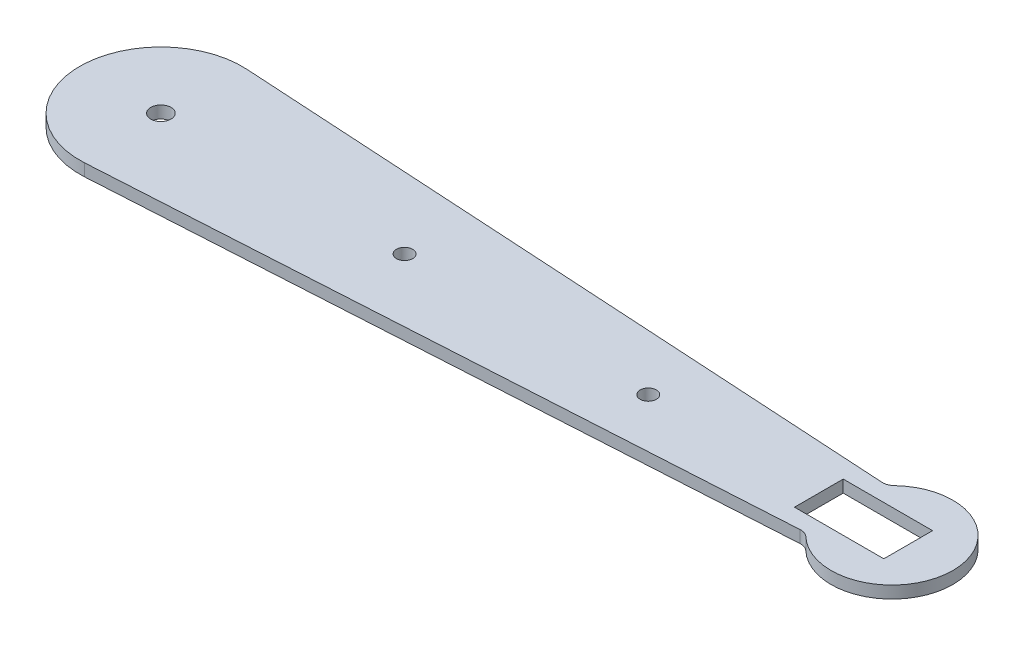
ISO-10303-21;
HEADER;
FILE_DESCRIPTION(('STEP AP214'),'2;1');
FILE_NAME('part.step','',(''),(''),'','','');
FILE_SCHEMA(('AUTOMOTIVE_DESIGN { 1 0 10303 214 1 1 1 1 }'));
ENDSEC;
DATA;
#1=APPLICATION_CONTEXT('core data for automotive mechanical design processes');
#2=APPLICATION_PROTOCOL_DEFINITION('international standard','automotive_design',2000,#1);
#3=PRODUCT_CONTEXT('',#1,'mechanical');
#4=PRODUCT('Part','Part','',(#3));
#5=PRODUCT_RELATED_PRODUCT_CATEGORY('part','',(#4));
#6=PRODUCT_DEFINITION_FORMATION('','',#4);
#7=PRODUCT_DEFINITION_CONTEXT('part definition',#1,'design');
#8=PRODUCT_DEFINITION('design','',#6,#7);
#9=PRODUCT_DEFINITION_SHAPE('','',#8);
#10=(LENGTH_UNIT() NAMED_UNIT(*) SI_UNIT(.MILLI.,.METRE.));
#11=(NAMED_UNIT(*) PLANE_ANGLE_UNIT() SI_UNIT($,.RADIAN.));
#12=(NAMED_UNIT(*) SI_UNIT($,.STERADIAN.) SOLID_ANGLE_UNIT());
#13=UNCERTAINTY_MEASURE_WITH_UNIT(LENGTH_MEASURE(1.E-05),#10,'distance_accuracy_value','');
#14=(GEOMETRIC_REPRESENTATION_CONTEXT(3) GLOBAL_UNCERTAINTY_ASSIGNED_CONTEXT((#13)) GLOBAL_UNIT_ASSIGNED_CONTEXT((#10,
#11,#12)) REPRESENTATION_CONTEXT('',''));
#15=CARTESIAN_POINT('',(0.,0.,0.));
#16=DIRECTION('',(0.,0.,1.));
#17=DIRECTION('',(1.,0.,0.));
#18=AXIS2_PLACEMENT_3D('',#15,#16,#17);
#19=CARTESIAN_POINT('',(167.629963347197,3.,13.076015953199));
#20=DIRECTION('',(0.,-1.,0.));
#21=DIRECTION('',(0.,0.,-1.));
#22=AXIS2_PLACEMENT_3D('',#19,#20,#21);
#23=CYLINDRICAL_SURFACE('',#22,3.);
#24=DIRECTION('',(0.,-1.,0.));
#25=VECTOR('',#24,1.);
#26=CARTESIAN_POINT('',(167.451945789046,3.,10.0813023193118));
#27=LINE('',#26,#25);
#28=CARTESIAN_POINT('',(167.451945789046,0.,10.0813023193118));
#29=VERTEX_POINT('',#28);
#30=CARTESIAN_POINT('',(167.451945789046,3.,10.0813023193118));
#31=VERTEX_POINT('',#30);
#32=EDGE_CURVE('E193',#29,#31,#27,.F.);
#33=ORIENTED_EDGE('',*,*,#32,.F.);
#34=CARTESIAN_POINT('',(167.629963347197,0.,13.076015953199));
#35=DIRECTION('',(0.,1.,0.));
#36=DIRECTION('',(0.,0.,1.));
#37=AXIS2_PLACEMENT_3D('',#34,#35,#36);
#38=CIRCLE('',#37,3.);
#39=CARTESIAN_POINT('',(169.691636122664,0.,10.8966799609992));
#40=VERTEX_POINT('',#39);
#41=EDGE_CURVE('E199',#29,#40,#38,.F.);
#42=ORIENTED_EDGE('',*,*,#41,.T.);
#43=DIRECTION('',(0.,-1.,0.));
#44=VECTOR('',#43,1.);
#45=CARTESIAN_POINT('',(169.691636122664,3.,10.8966799609992));
#46=LINE('',#45,#44);
#47=CARTESIAN_POINT('',(169.691636122664,3.,10.8966799609992));
#48=VERTEX_POINT('',#47);
#49=EDGE_CURVE('E196',#48,#40,#46,.T.);
#50=ORIENTED_EDGE('',*,*,#49,.F.);
#51=CARTESIAN_POINT('',(167.629963347197,3.,13.076015953199));
#52=DIRECTION('',(0.,1.,0.));
#53=DIRECTION('',(0.,0.,1.));
#54=AXIS2_PLACEMENT_3D('',#51,#52,#53);
#55=CIRCLE('',#54,3.);
#56=EDGE_CURVE('E201',#48,#31,#55,.T.);
#57=ORIENTED_EDGE('',*,*,#56,.T.);
#58=EDGE_LOOP('',(#33,#42,#50,#57));
#59=FACE_BOUND('',#58,.T.);
#60=ADVANCED_FACE('F36',(#59),#23,.F.);
#61=CARTESIAN_POINT('',(167.629963347197,3.,-13.076015953199));
#62=DIRECTION('',(0.,-1.,0.));
#63=DIRECTION('',(0.,0.,-1.));
#64=AXIS2_PLACEMENT_3D('',#61,#62,#63);
#65=CYLINDRICAL_SURFACE('',#64,3.);
#66=DIRECTION('',(0.,1.,0.));
#67=VECTOR('',#66,1.);
#68=CARTESIAN_POINT('',(167.451945789046,3.,-10.0813023193118));
#69=LINE('',#68,#67);
#70=CARTESIAN_POINT('',(167.451945789046,3.,-10.0813023193118));
#71=VERTEX_POINT('',#70);
#72=CARTESIAN_POINT('',(167.451945789046,0.,-10.0813023193118));
#73=VERTEX_POINT('',#72);
#74=EDGE_CURVE('E182',#71,#73,#69,.F.);
#75=ORIENTED_EDGE('',*,*,#74,.F.);
#76=CARTESIAN_POINT('',(167.629963347197,3.,-13.076015953199));
#77=DIRECTION('',(0.,1.,0.));
#78=DIRECTION('',(0.,0.,1.));
#79=AXIS2_PLACEMENT_3D('',#76,#77,#78);
#80=CIRCLE('',#79,3.);
#81=CARTESIAN_POINT('',(169.691636122664,3.,-10.8966799609992));
#82=VERTEX_POINT('',#81);
#83=EDGE_CURVE('E188',#71,#82,#80,.T.);
#84=ORIENTED_EDGE('',*,*,#83,.T.);
#85=DIRECTION('',(0.,-1.,0.));
#86=VECTOR('',#85,1.);
#87=CARTESIAN_POINT('',(169.691636122664,3.,-10.8966799609992));
#88=LINE('',#87,#86);
#89=CARTESIAN_POINT('',(169.691636122664,0.,-10.8966799609992));
#90=VERTEX_POINT('',#89);
#91=EDGE_CURVE('E185',#90,#82,#88,.F.);
#92=ORIENTED_EDGE('',*,*,#91,.F.);
#93=CARTESIAN_POINT('',(167.629963347197,0.,-13.076015953199));
#94=DIRECTION('',(0.,1.,0.));
#95=DIRECTION('',(0.,0.,1.));
#96=AXIS2_PLACEMENT_3D('',#93,#94,#95);
#97=CIRCLE('',#96,3.);
#98=EDGE_CURVE('E191',#90,#73,#97,.F.);
#99=ORIENTED_EDGE('',*,*,#98,.T.);
#100=EDGE_LOOP('',(#75,#84,#92,#99));
#101=FACE_BOUND('',#100,.T.);
#102=ADVANCED_FACE('F224',(#101),#65,.F.);
#103=CARTESIAN_POINT('',(-81.2636304353254,3.,24.8659344966924));
#104=DIRECTION('',(0.0593391860503703,0.,0.998237877962402));
#105=DIRECTION('',(0.998237877962402,0.,-0.0593391860503703));
#106=AXIS2_PLACEMENT_3D('',#103,#104,#105);
#107=PLANE('',#106);
#108=DIRECTION('',(-0.998237877962402,0.,0.0593391860503703));
#109=VECTOR('',#108,1.);
#110=CARTESIAN_POINT('',(-81.2636304353254,0.,24.8659344966924));
#111=LINE('',#110,#109);
#112=CARTESIAN_POINT('',(1.1867837210074,0.,19.964757559248));
#113=VERTEX_POINT('',#112);
#114=EDGE_CURVE('E163',#29,#113,#111,.T.);
#115=ORIENTED_EDGE('',*,*,#114,.F.);
#116=ORIENTED_EDGE('',*,*,#32,.T.);
#117=DIRECTION('',(-0.998237877962402,0.,0.0593391860503703));
#118=VECTOR('',#117,1.);
#119=CARTESIAN_POINT('',(-81.2636304353254,3.,24.8659344966924));
#120=LINE('',#119,#118);
#121=CARTESIAN_POINT('',(1.1867837210074,3.,19.964757559248));
#122=VERTEX_POINT('',#121);
#123=EDGE_CURVE('E144',#31,#122,#120,.T.);
#124=ORIENTED_EDGE('',*,*,#123,.T.);
#125=DIRECTION('',(0.,-1.,0.));
#126=VECTOR('',#125,1.);
#127=CARTESIAN_POINT('',(1.1867837210074,3.,19.964757559248));
#128=LINE('',#127,#126);
#129=EDGE_CURVE('E160',#122,#113,#128,.T.);
#130=ORIENTED_EDGE('',*,*,#129,.T.);
#131=EDGE_LOOP('',(#115,#116,#124,#130));
#132=FACE_BOUND('',#131,.T.);
#133=ADVANCED_FACE('F229',(#132),#107,.T.);
#134=CARTESIAN_POINT('',(180.,3.,0.));
#135=DIRECTION('',(0.,-1.,0.));
#136=DIRECTION('',(0.,0.,-1.));
#137=AXIS2_PLACEMENT_3D('',#134,#135,#136);
#138=CYLINDRICAL_SURFACE('',#137,15.);
#139=CARTESIAN_POINT('',(180.,3.,0.));
#140=DIRECTION('',(0.,1.,0.));
#141=DIRECTION('',(0.,0.,1.));
#142=AXIS2_PLACEMENT_3D('',#139,#140,#141);
#143=CIRCLE('',#142,15.);
#144=EDGE_CURVE('E147',#48,#82,#143,.T.);
#145=ORIENTED_EDGE('',*,*,#144,.F.);
#146=ORIENTED_EDGE('',*,*,#49,.T.);
#147=CARTESIAN_POINT('',(180.,0.,0.));
#148=DIRECTION('',(0.,1.,0.));
#149=DIRECTION('',(0.,0.,1.));
#150=AXIS2_PLACEMENT_3D('',#147,#148,#149);
#151=CIRCLE('',#150,15.);
#152=EDGE_CURVE('E165',#40,#90,#151,.T.);
#153=ORIENTED_EDGE('',*,*,#152,.T.);
#154=ORIENTED_EDGE('',*,*,#91,.T.);
#155=EDGE_LOOP('',(#145,#146,#153,#154));
#156=FACE_BOUND('',#155,.T.);
#157=ADVANCED_FACE('F245',(#156),#138,.T.);
#158=CARTESIAN_POINT('',(-81.2636304353254,3.,-24.8659344966924));
#159=DIRECTION('',(-0.0593391860503703,0.,0.998237877962402));
#160=DIRECTION('',(0.998237877962402,0.,0.0593391860503703));
#161=AXIS2_PLACEMENT_3D('',#158,#159,#160);
#162=PLANE('',#161);
#163=DIRECTION('',(-0.998237877962402,0.,-0.0593391860503703));
#164=VECTOR('',#163,1.);
#165=CARTESIAN_POINT('',(-81.2636304353254,3.,-24.8659344966924));
#166=LINE('',#165,#164);
#167=CARTESIAN_POINT('',(1.1867837210074,3.,-19.964757559248));
#168=VERTEX_POINT('',#167);
#169=EDGE_CURVE('E149',#71,#168,#166,.T.);
#170=ORIENTED_EDGE('',*,*,#169,.F.);
#171=ORIENTED_EDGE('',*,*,#74,.T.);
#172=DIRECTION('',(-0.998237877962402,0.,-0.0593391860503703));
#173=VECTOR('',#172,1.);
#174=CARTESIAN_POINT('',(-81.2636304353254,0.,-24.8659344966924));
#175=LINE('',#174,#173);
#176=CARTESIAN_POINT('',(1.1867837210074,0.,-19.964757559248));
#177=VERTEX_POINT('',#176);
#178=EDGE_CURVE('E167',#73,#177,#175,.T.);
#179=ORIENTED_EDGE('',*,*,#178,.T.);
#180=DIRECTION('',(0.,-1.,0.));
#181=VECTOR('',#180,1.);
#182=CARTESIAN_POINT('',(1.1867837210074,3.,-19.964757559248));
#183=LINE('',#182,#181);
#184=EDGE_CURVE('E179',#168,#177,#183,.T.);
#185=ORIENTED_EDGE('',*,*,#184,.F.);
#186=EDGE_LOOP('',(#170,#171,#179,#185));
#187=FACE_BOUND('',#186,.T.);
#188=ADVANCED_FACE('F251',(#187),#162,.F.);
#189=CARTESIAN_POINT('',(120.,3.,0.));
#190=DIRECTION('',(0.,-1.,0.));
#191=DIRECTION('',(0.,0.,-1.));
#192=AXIS2_PLACEMENT_3D('',#189,#190,#191);
#193=CYLINDRICAL_SURFACE('',#192,2.);
#194=CARTESIAN_POINT('',(120.,3.,0.));
#195=DIRECTION('',(0.,1.,0.));
#196=DIRECTION('',(0.,0.,1.));
#197=AXIS2_PLACEMENT_3D('',#194,#195,#196);
#198=CIRCLE('',#197,2.);
#199=CARTESIAN_POINT('',(120.,3.,2.));
#200=VERTEX_POINT('',#199);
#201=EDGE_CURVE('E154',#200,#200,#198,.T.);
#202=ORIENTED_EDGE('',*,*,#201,.T.);
#203=EDGE_LOOP('',(#202));
#204=FACE_BOUND('',#203,.T.);
#205=CARTESIAN_POINT('',(120.,0.,0.));
#206=DIRECTION('',(0.,1.,0.));
#207=DIRECTION('',(0.,0.,1.));
#208=AXIS2_PLACEMENT_3D('',#205,#206,#207);
#209=CIRCLE('',#208,2.);
#210=CARTESIAN_POINT('',(120.,0.,2.));
#211=VERTEX_POINT('',#210);
#212=EDGE_CURVE('E172',#211,#211,#209,.T.);
#213=ORIENTED_EDGE('',*,*,#212,.F.);
#214=EDGE_LOOP('',(#213));
#215=FACE_BOUND('',#214,.T.);
#216=ADVANCED_FACE('F257',(#204,#215),#193,.F.);
#217=CARTESIAN_POINT('',(0.,3.,0.));
#218=DIRECTION('',(0.,-1.,0.));
#219=DIRECTION('',(0.,0.,-1.));
#220=AXIS2_PLACEMENT_3D('',#217,#218,#219);
#221=CYLINDRICAL_SURFACE('',#220,20.);
#222=CARTESIAN_POINT('',(0.,0.,0.));
#223=DIRECTION('',(0.,1.,0.));
#224=DIRECTION('',(0.,0.,1.));
#225=AXIS2_PLACEMENT_3D('',#222,#223,#224);
#226=CIRCLE('',#225,20.);
#227=EDGE_CURVE('E169',#177,#113,#226,.T.);
#228=ORIENTED_EDGE('',*,*,#227,.T.);
#229=ORIENTED_EDGE('',*,*,#129,.F.);
#230=CARTESIAN_POINT('',(0.,3.,0.));
#231=DIRECTION('',(0.,1.,0.));
#232=DIRECTION('',(0.,0.,1.));
#233=AXIS2_PLACEMENT_3D('',#230,#231,#232);
#234=CIRCLE('',#233,20.);
#235=EDGE_CURVE('E151',#168,#122,#234,.T.);
#236=ORIENTED_EDGE('',*,*,#235,.F.);
#237=ORIENTED_EDGE('',*,*,#184,.T.);
#238=EDGE_LOOP('',(#228,#229,#236,#237));
#239=FACE_BOUND('',#238,.T.);
#240=ADVANCED_FACE('F254',(#239),#221,.T.);
#241=CARTESIAN_POINT('',(60.,3.,0.));
#242=DIRECTION('',(0.,-1.,0.));
#243=DIRECTION('',(0.,0.,-1.));
#244=AXIS2_PLACEMENT_3D('',#241,#242,#243);
#245=CYLINDRICAL_SURFACE('',#244,2.);
#246=CARTESIAN_POINT('',(60.,3.,0.));
#247=DIRECTION('',(0.,1.,0.));
#248=DIRECTION('',(0.,0.,1.));
#249=AXIS2_PLACEMENT_3D('',#246,#247,#248);
#250=CIRCLE('',#249,2.);
#251=CARTESIAN_POINT('',(60.,3.,2.));
#252=VERTEX_POINT('',#251);
#253=EDGE_CURVE('E141',#252,#252,#250,.T.);
#254=ORIENTED_EDGE('',*,*,#253,.T.);
#255=EDGE_LOOP('',(#254));
#256=FACE_BOUND('',#255,.T.);
#257=CARTESIAN_POINT('',(60.,0.,0.));
#258=DIRECTION('',(0.,1.,0.));
#259=DIRECTION('',(0.,0.,1.));
#260=AXIS2_PLACEMENT_3D('',#257,#258,#259);
#261=CIRCLE('',#260,2.);
#262=CARTESIAN_POINT('',(60.,0.,2.));
#263=VERTEX_POINT('',#262);
#264=EDGE_CURVE('E138',#263,#263,#261,.T.);
#265=ORIENTED_EDGE('',*,*,#264,.F.);
#266=EDGE_LOOP('',(#265));
#267=FACE_BOUND('',#266,.T.);
#268=ADVANCED_FACE('F256',(#256,#267),#245,.F.);
#269=CARTESIAN_POINT('',(0.,3.,0.));
#270=DIRECTION('',(0.,-1.,0.));
#271=DIRECTION('',(0.,0.,-1.));
#272=AXIS2_PLACEMENT_3D('',#269,#270,#271);
#273=CYLINDRICAL_SURFACE('',#272,2.5);
#274=CARTESIAN_POINT('',(0.,3.,0.));
#275=DIRECTION('',(0.,1.,0.));
#276=DIRECTION('',(0.,0.,1.));
#277=AXIS2_PLACEMENT_3D('',#274,#275,#276);
#278=CIRCLE('',#277,2.5);
#279=CARTESIAN_POINT('',(0.,3.,2.5));
#280=VERTEX_POINT('',#279);
#281=EDGE_CURVE('E157',#280,#280,#278,.T.);
#282=ORIENTED_EDGE('',*,*,#281,.T.);
#283=EDGE_LOOP('',(#282));
#284=FACE_BOUND('',#283,.T.);
#285=CARTESIAN_POINT('',(0.,0.,0.));
#286=DIRECTION('',(0.,1.,0.));
#287=DIRECTION('',(0.,0.,1.));
#288=AXIS2_PLACEMENT_3D('',#285,#286,#287);
#289=CIRCLE('',#288,2.5);
#290=CARTESIAN_POINT('',(0.,0.,2.5));
#291=VERTEX_POINT('',#290);
#292=EDGE_CURVE('E145',#291,#291,#289,.T.);
#293=ORIENTED_EDGE('',*,*,#292,.F.);
#294=EDGE_LOOP('',(#293));
#295=FACE_BOUND('',#294,.T.);
#296=ADVANCED_FACE('F263',(#284,#295),#273,.F.);
#297=CARTESIAN_POINT('',(-82.7417593923505,3.,0.));
#298=DIRECTION('',(0.,1.,0.));
#299=DIRECTION('',(0.,0.,1.));
#300=AXIS2_PLACEMENT_3D('',#297,#298,#299);
#301=PLANE('',#300);
#302=DIRECTION('',(0.,0.,1.));
#303=VECTOR('',#302,1.);
#304=CARTESIAN_POINT('',(162.,3.,-6.));
#305=LINE('',#304,#303);
#306=CARTESIAN_POINT('',(162.,3.,-6.));
#307=VERTEX_POINT('',#306);
#308=CARTESIAN_POINT('',(162.,3.,6.));
#309=VERTEX_POINT('',#308);
#310=EDGE_CURVE('E50',#307,#309,#305,.T.);
#311=ORIENTED_EDGE('',*,*,#310,.F.);
#312=DIRECTION('',(-1.,0.,0.));
#313=VECTOR('',#312,1.);
#314=CARTESIAN_POINT('',(162.,3.,-6.));
#315=LINE('',#314,#313);
#316=CARTESIAN_POINT('',(184.,3.,-6.));
#317=VERTEX_POINT('',#316);
#318=EDGE_CURVE('E131',#317,#307,#315,.T.);
#319=ORIENTED_EDGE('',*,*,#318,.F.);
#320=DIRECTION('',(0.,0.,-1.));
#321=VECTOR('',#320,1.);
#322=CARTESIAN_POINT('',(184.,3.,-6.));
#323=LINE('',#322,#321);
#324=CARTESIAN_POINT('',(184.,3.,6.));
#325=VERTEX_POINT('',#324);
#326=EDGE_CURVE('E115',#325,#317,#323,.T.);
#327=ORIENTED_EDGE('',*,*,#326,.F.);
#328=DIRECTION('',(1.,0.,0.));
#329=VECTOR('',#328,1.);
#330=CARTESIAN_POINT('',(162.,3.,6.));
#331=LINE('',#330,#329);
#332=EDGE_CURVE('E124',#309,#325,#331,.T.);
#333=ORIENTED_EDGE('',*,*,#332,.F.);
#334=EDGE_LOOP('',(#311,#319,#327,#333));
#335=FACE_BOUND('',#334,.T.);
#336=ORIENTED_EDGE('',*,*,#56,.F.);
#337=ORIENTED_EDGE('',*,*,#144,.T.);
#338=ORIENTED_EDGE('',*,*,#83,.F.);
#339=ORIENTED_EDGE('',*,*,#169,.T.);
#340=ORIENTED_EDGE('',*,*,#235,.T.);
#341=ORIENTED_EDGE('',*,*,#123,.F.);
#342=EDGE_LOOP('',(#336,#337,#338,#339,#340,#341));
#343=FACE_BOUND('',#342,.T.);
#344=ORIENTED_EDGE('',*,*,#253,.F.);
#345=EDGE_LOOP('',(#344));
#346=FACE_BOUND('',#345,.T.);
#347=ORIENTED_EDGE('',*,*,#201,.F.);
#348=EDGE_LOOP('',(#347));
#349=FACE_BOUND('',#348,.T.);
#350=ORIENTED_EDGE('',*,*,#281,.F.);
#351=EDGE_LOOP('',(#350));
#352=FACE_BOUND('',#351,.T.);
#353=ADVANCED_FACE('F128',(#335,#343,#346,#349,#352),#301,.T.);
#354=CARTESIAN_POINT('',(-82.7417593923505,0.,0.));
#355=DIRECTION('',(0.,1.,0.));
#356=DIRECTION('',(0.,0.,1.));
#357=AXIS2_PLACEMENT_3D('',#354,#355,#356);
#358=PLANE('',#357);
#359=DIRECTION('',(-1.,0.,0.));
#360=VECTOR('',#359,1.);
#361=CARTESIAN_POINT('',(-82.7417593923505,0.,-6.));
#362=LINE('',#361,#360);
#363=CARTESIAN_POINT('',(184.,0.,-6.));
#364=VERTEX_POINT('',#363);
#365=CARTESIAN_POINT('',(162.,0.,-6.));
#366=VERTEX_POINT('',#365);
#367=EDGE_CURVE('E43',#364,#366,#362,.T.);
#368=ORIENTED_EDGE('',*,*,#367,.T.);
#369=DIRECTION('',(0.,0.,1.));
#370=VECTOR('',#369,1.);
#371=CARTESIAN_POINT('',(162.,0.,0.));
#372=LINE('',#371,#370);
#373=CARTESIAN_POINT('',(162.,0.,6.));
#374=VERTEX_POINT('',#373);
#375=EDGE_CURVE('E11',#366,#374,#372,.T.);
#376=ORIENTED_EDGE('',*,*,#375,.T.);
#377=DIRECTION('',(1.,0.,0.));
#378=VECTOR('',#377,1.);
#379=CARTESIAN_POINT('',(-82.7417593923505,0.,6.));
#380=LINE('',#379,#378);
#381=CARTESIAN_POINT('',(184.,0.,6.));
#382=VERTEX_POINT('',#381);
#383=EDGE_CURVE('E203',#374,#382,#380,.T.);
#384=ORIENTED_EDGE('',*,*,#383,.T.);
#385=DIRECTION('',(0.,0.,-1.));
#386=VECTOR('',#385,1.);
#387=CARTESIAN_POINT('',(184.,0.,0.));
#388=LINE('',#387,#386);
#389=EDGE_CURVE('E118',#382,#364,#388,.T.);
#390=ORIENTED_EDGE('',*,*,#389,.T.);
#391=EDGE_LOOP('',(#368,#376,#384,#390));
#392=FACE_BOUND('',#391,.T.);
#393=ORIENTED_EDGE('',*,*,#41,.F.);
#394=ORIENTED_EDGE('',*,*,#114,.T.);
#395=ORIENTED_EDGE('',*,*,#227,.F.);
#396=ORIENTED_EDGE('',*,*,#178,.F.);
#397=ORIENTED_EDGE('',*,*,#98,.F.);
#398=ORIENTED_EDGE('',*,*,#152,.F.);
#399=EDGE_LOOP('',(#393,#394,#395,#396,#397,#398));
#400=FACE_BOUND('',#399,.T.);
#401=ORIENTED_EDGE('',*,*,#264,.T.);
#402=EDGE_LOOP('',(#401));
#403=FACE_BOUND('',#402,.T.);
#404=ORIENTED_EDGE('',*,*,#212,.T.);
#405=EDGE_LOOP('',(#404));
#406=FACE_BOUND('',#405,.T.);
#407=ORIENTED_EDGE('',*,*,#292,.T.);
#408=EDGE_LOOP('',(#407));
#409=FACE_BOUND('',#408,.T.);
#410=ADVANCED_FACE('F207',(#392,#400,#403,#406,#409),#358,.F.);
#411=CARTESIAN_POINT('',(162.,-7.,-6.));
#412=DIRECTION('',(-1.,0.,0.));
#413=DIRECTION('',(0.,0.,1.));
#414=AXIS2_PLACEMENT_3D('',#411,#412,#413);
#415=PLANE('',#414);
#416=DIRECTION('',(0.,1.,0.));
#417=VECTOR('',#416,1.);
#418=CARTESIAN_POINT('',(162.,-7.,-6.));
#419=LINE('',#418,#417);
#420=EDGE_CURVE('E136',#366,#307,#419,.T.);
#421=ORIENTED_EDGE('',*,*,#420,.T.);
#422=ORIENTED_EDGE('',*,*,#310,.T.);
#423=DIRECTION('',(0.,1.,0.));
#424=VECTOR('',#423,1.);
#425=CARTESIAN_POINT('',(162.,-7.,6.));
#426=LINE('',#425,#424);
#427=EDGE_CURVE('E121',#374,#309,#426,.T.);
#428=ORIENTED_EDGE('',*,*,#427,.F.);
#429=ORIENTED_EDGE('',*,*,#375,.F.);
#430=EDGE_LOOP('',(#421,#422,#428,#429));
#431=FACE_BOUND('',#430,.T.);
#432=ADVANCED_FACE('F212',(#431),#415,.F.);
#433=CARTESIAN_POINT('',(162.,-7.,-6.));
#434=DIRECTION('',(0.,0.,-1.));
#435=DIRECTION('',(-1.,0.,0.));
#436=AXIS2_PLACEMENT_3D('',#433,#434,#435);
#437=PLANE('',#436);
#438=DIRECTION('',(0.,1.,0.));
#439=VECTOR('',#438,1.);
#440=CARTESIAN_POINT('',(184.,-7.,-6.));
#441=LINE('',#440,#439);
#442=EDGE_CURVE('E120',#364,#317,#441,.T.);
#443=ORIENTED_EDGE('',*,*,#442,.T.);
#444=ORIENTED_EDGE('',*,*,#318,.T.);
#445=ORIENTED_EDGE('',*,*,#420,.F.);
#446=ORIENTED_EDGE('',*,*,#367,.F.);
#447=EDGE_LOOP('',(#443,#444,#445,#446));
#448=FACE_BOUND('',#447,.T.);
#449=ADVANCED_FACE('F211',(#448),#437,.F.);
#450=CARTESIAN_POINT('',(184.,-7.,-6.));
#451=DIRECTION('',(1.,0.,0.));
#452=DIRECTION('',(0.,0.,-1.));
#453=AXIS2_PLACEMENT_3D('',#450,#451,#452);
#454=PLANE('',#453);
#455=DIRECTION('',(0.,1.,0.));
#456=VECTOR('',#455,1.);
#457=CARTESIAN_POINT('',(184.,-7.,6.));
#458=LINE('',#457,#456);
#459=EDGE_CURVE('E58',#382,#325,#458,.T.);
#460=ORIENTED_EDGE('',*,*,#459,.T.);
#461=ORIENTED_EDGE('',*,*,#326,.T.);
#462=ORIENTED_EDGE('',*,*,#442,.F.);
#463=ORIENTED_EDGE('',*,*,#389,.F.);
#464=EDGE_LOOP('',(#460,#461,#462,#463));
#465=FACE_BOUND('',#464,.T.);
#466=ADVANCED_FACE('F112',(#465),#454,.F.);
#467=CARTESIAN_POINT('',(162.,-7.,6.));
#468=DIRECTION('',(0.,0.,1.));
#469=DIRECTION('',(1.,0.,0.));
#470=AXIS2_PLACEMENT_3D('',#467,#468,#469);
#471=PLANE('',#470);
#472=ORIENTED_EDGE('',*,*,#427,.T.);
#473=ORIENTED_EDGE('',*,*,#332,.T.);
#474=ORIENTED_EDGE('',*,*,#459,.F.);
#475=ORIENTED_EDGE('',*,*,#383,.F.);
#476=EDGE_LOOP('',(#472,#473,#474,#475));
#477=FACE_BOUND('',#476,.T.);
#478=ADVANCED_FACE('F125',(#477),#471,.F.);
#479=CLOSED_SHELL('',(#60,#102,#133,#157,#188,#216,#240,#268,#296,#353,#410,#432,#449,#466,#478));
#480=MANIFOLD_SOLID_BREP('B2',#479);
#481=ADVANCED_BREP_SHAPE_REPRESENTATION('',(#18,#480),#14);
#482=SHAPE_DEFINITION_REPRESENTATION(#9,#481);
ENDSEC;
END-ISO-10303-21;
